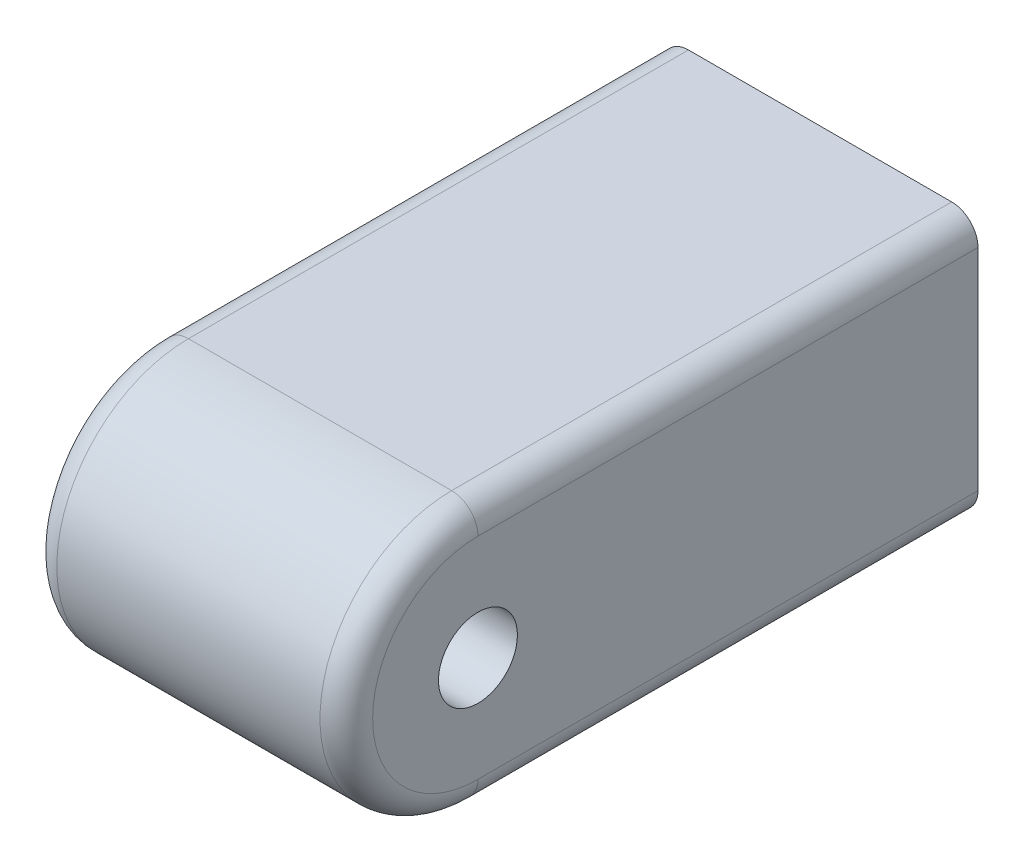
ISO-10303-21;
HEADER;
FILE_DESCRIPTION(('STEP AP214'),'2;1');
FILE_NAME('part.step','',(''),(''),'','','');
FILE_SCHEMA(('AUTOMOTIVE_DESIGN { 1 0 10303 214 1 1 1 1 }'));
ENDSEC;
DATA;
#1=APPLICATION_CONTEXT('core data for automotive mechanical design processes');
#2=APPLICATION_PROTOCOL_DEFINITION('international standard','automotive_design',2000,#1);
#3=PRODUCT_CONTEXT('',#1,'mechanical');
#4=PRODUCT('Part','Part','',(#3));
#5=PRODUCT_RELATED_PRODUCT_CATEGORY('part','',(#4));
#6=PRODUCT_DEFINITION_FORMATION('','',#4);
#7=PRODUCT_DEFINITION_CONTEXT('part definition',#1,'design');
#8=PRODUCT_DEFINITION('design','',#6,#7);
#9=PRODUCT_DEFINITION_SHAPE('','',#8);
#10=(LENGTH_UNIT() NAMED_UNIT(*) SI_UNIT(.MILLI.,.METRE.));
#11=(NAMED_UNIT(*) PLANE_ANGLE_UNIT() SI_UNIT($,.RADIAN.));
#12=(NAMED_UNIT(*) SI_UNIT($,.STERADIAN.) SOLID_ANGLE_UNIT());
#13=UNCERTAINTY_MEASURE_WITH_UNIT(LENGTH_MEASURE(1.E-05),#10,'distance_accuracy_value','');
#14=(GEOMETRIC_REPRESENTATION_CONTEXT(3) GLOBAL_UNCERTAINTY_ASSIGNED_CONTEXT((#13)) GLOBAL_UNIT_ASSIGNED_CONTEXT((#10,
#11,#12)) REPRESENTATION_CONTEXT('',''));
#15=CARTESIAN_POINT('',(0.,0.,0.));
#16=DIRECTION('',(0.,0.,1.));
#17=DIRECTION('',(1.,0.,0.));
#18=AXIS2_PLACEMENT_3D('',#15,#16,#17);
#19=CARTESIAN_POINT('',(60.,0.,35.));
#20=DIRECTION('',(-1.,0.,0.));
#21=DIRECTION('',(0.,0.,1.));
#22=AXIS2_PLACEMENT_3D('',#19,#20,#21);
#23=CYLINDRICAL_SURFACE('',#22,25.);
#24=DIRECTION('',(-1.,0.,0.));
#25=VECTOR('',#24,1.);
#26=CARTESIAN_POINT('',(60.,25.,35.));
#27=LINE('',#26,#25);
#28=CARTESIAN_POINT('',(55.,25.,35.));
#29=VERTEX_POINT('',#28);
#30=CARTESIAN_POINT('',(5.,25.,35.));
#31=VERTEX_POINT('',#30);
#32=EDGE_CURVE('E183',#29,#31,#27,.T.);
#33=ORIENTED_EDGE('',*,*,#32,.T.);
#34=CARTESIAN_POINT('',(5.,0.,35.));
#35=DIRECTION('',(1.,0.,0.));
#36=DIRECTION('',(0.,0.,-1.));
#37=AXIS2_PLACEMENT_3D('',#34,#35,#36);
#38=CIRCLE('',#37,25.);
#39=CARTESIAN_POINT('',(5.,-25.,35.));
#40=VERTEX_POINT('',#39);
#41=EDGE_CURVE('E218',#31,#40,#38,.T.);
#42=ORIENTED_EDGE('',*,*,#41,.T.);
#43=DIRECTION('',(-1.,0.,0.));
#44=VECTOR('',#43,1.);
#45=CARTESIAN_POINT('',(60.,-25.,35.));
#46=LINE('',#45,#44);
#47=CARTESIAN_POINT('',(55.,-25.,35.));
#48=VERTEX_POINT('',#47);
#49=EDGE_CURVE('E194',#48,#40,#46,.T.);
#50=ORIENTED_EDGE('',*,*,#49,.F.);
#51=CARTESIAN_POINT('',(55.,0.,35.));
#52=DIRECTION('',(1.,0.,0.));
#53=DIRECTION('',(0.,0.,-1.));
#54=AXIS2_PLACEMENT_3D('',#51,#52,#53);
#55=CIRCLE('',#54,25.);
#56=EDGE_CURVE('E216',#48,#29,#55,.F.);
#57=ORIENTED_EDGE('',*,*,#56,.T.);
#58=EDGE_LOOP('',(#33,#42,#50,#57));
#59=FACE_BOUND('',#58,.T.);
#60=ADVANCED_FACE('F37',(#59),#23,.T.);
#61=CARTESIAN_POINT('',(60.,-25.,-60.));
#62=DIRECTION('',(0.,1.,0.));
#63=DIRECTION('',(0.,0.,1.));
#64=AXIS2_PLACEMENT_3D('',#61,#62,#63);
#65=PLANE('',#64);
#66=ORIENTED_EDGE('',*,*,#49,.T.);
#67=DIRECTION('',(0.,0.,-1.));
#68=VECTOR('',#67,1.);
#69=CARTESIAN_POINT('',(5.,-25.,-60.));
#70=LINE('',#69,#68);
#71=CARTESIAN_POINT('',(5.,-25.,-60.));
#72=VERTEX_POINT('',#71);
#73=EDGE_CURVE('E199',#40,#72,#70,.T.);
#74=ORIENTED_EDGE('',*,*,#73,.T.);
#75=DIRECTION('',(-1.,0.,0.));
#76=VECTOR('',#75,1.);
#77=CARTESIAN_POINT('',(60.,-25.,-60.));
#78=LINE('',#77,#76);
#79=CARTESIAN_POINT('',(55.,-25.,-60.));
#80=VERTEX_POINT('',#79);
#81=EDGE_CURVE('E191',#80,#72,#78,.T.);
#82=ORIENTED_EDGE('',*,*,#81,.F.);
#83=DIRECTION('',(0.,0.,-1.));
#84=VECTOR('',#83,1.);
#85=CARTESIAN_POINT('',(55.,-25.,35.));
#86=LINE('',#85,#84);
#87=EDGE_CURVE('E197',#80,#48,#86,.F.);
#88=ORIENTED_EDGE('',*,*,#87,.T.);
#89=EDGE_LOOP('',(#66,#74,#82,#88));
#90=FACE_BOUND('',#89,.T.);
#91=ADVANCED_FACE('F262',(#90),#65,.F.);
#92=CARTESIAN_POINT('',(60.,25.,-60.));
#93=DIRECTION('',(0.,0.,1.));
#94=DIRECTION('',(1.,0.,0.));
#95=AXIS2_PLACEMENT_3D('',#92,#93,#94);
#96=PLANE('',#95);
#97=CARTESIAN_POINT('',(2.5,0.,-60.));
#98=DIRECTION('',(0.,0.,-1.));
#99=DIRECTION('',(-1.,0.,0.));
#100=AXIS2_PLACEMENT_3D('',#97,#98,#99);
#101=CIRCLE('',#100,1.5);
#102=CARTESIAN_POINT('',(1.,0.,-60.));
#103=VERTEX_POINT('',#102);
#104=EDGE_CURVE('E230',#103,#103,#101,.T.);
#105=ORIENTED_EDGE('',*,*,#104,.F.);
#106=EDGE_LOOP('',(#105));
#107=FACE_BOUND('',#106,.T.);
#108=CARTESIAN_POINT('',(57.5,0.,-60.));
#109=DIRECTION('',(0.,0.,-1.));
#110=DIRECTION('',(-1.,0.,0.));
#111=AXIS2_PLACEMENT_3D('',#108,#109,#110);
#112=CIRCLE('',#111,1.5);
#113=CARTESIAN_POINT('',(56.,0.,-60.));
#114=VERTEX_POINT('',#113);
#115=EDGE_CURVE('E553',#114,#114,#112,.T.);
#116=ORIENTED_EDGE('',*,*,#115,.F.);
#117=EDGE_LOOP('',(#116));
#118=FACE_BOUND('',#117,.T.);
#119=CARTESIAN_POINT('',(10.,22.5,-60.));
#120=DIRECTION('',(0.,0.,-1.));
#121=DIRECTION('',(-1.,0.,0.));
#122=AXIS2_PLACEMENT_3D('',#119,#120,#121);
#123=CIRCLE('',#122,1.5);
#124=CARTESIAN_POINT('',(8.5,22.5,-60.));
#125=VERTEX_POINT('',#124);
#126=EDGE_CURVE('E557',#125,#125,#123,.T.);
#127=ORIENTED_EDGE('',*,*,#126,.F.);
#128=EDGE_LOOP('',(#127));
#129=FACE_BOUND('',#128,.T.);
#130=CARTESIAN_POINT('',(10.,-22.5,-60.));
#131=DIRECTION('',(0.,0.,-1.));
#132=DIRECTION('',(-1.,0.,0.));
#133=AXIS2_PLACEMENT_3D('',#130,#131,#132);
#134=CIRCLE('',#133,1.5);
#135=CARTESIAN_POINT('',(8.5,-22.5,-60.));
#136=VERTEX_POINT('',#135);
#137=EDGE_CURVE('E561',#136,#136,#134,.T.);
#138=ORIENTED_EDGE('',*,*,#137,.F.);
#139=EDGE_LOOP('',(#138));
#140=FACE_BOUND('',#139,.T.);
#141=CARTESIAN_POINT('',(50.,-22.5,-60.));
#142=DIRECTION('',(0.,0.,-1.));
#143=DIRECTION('',(-1.,0.,0.));
#144=AXIS2_PLACEMENT_3D('',#141,#142,#143);
#145=CIRCLE('',#144,1.5);
#146=CARTESIAN_POINT('',(48.5,-22.5,-60.));
#147=VERTEX_POINT('',#146);
#148=EDGE_CURVE('E565',#147,#147,#145,.T.);
#149=ORIENTED_EDGE('',*,*,#148,.F.);
#150=EDGE_LOOP('',(#149));
#151=FACE_BOUND('',#150,.T.);
#152=CARTESIAN_POINT('',(50.,22.5,-60.));
#153=DIRECTION('',(0.,0.,-1.));
#154=DIRECTION('',(-1.,0.,0.));
#155=AXIS2_PLACEMENT_3D('',#152,#153,#154);
#156=CIRCLE('',#155,1.5);
#157=CARTESIAN_POINT('',(48.5,22.5,-60.));
#158=VERTEX_POINT('',#157);
#159=EDGE_CURVE('E158',#158,#158,#156,.T.);
#160=ORIENTED_EDGE('',*,*,#159,.F.);
#161=EDGE_LOOP('',(#160));
#162=FACE_BOUND('',#161,.T.);
#163=DIRECTION('',(1.,0.,0.));
#164=VECTOR('',#163,1.);
#165=CARTESIAN_POINT('',(55.,20.,-60.));
#166=LINE('',#165,#164);
#167=CARTESIAN_POINT('',(4.99999999999999,20.,-60.));
#168=VERTEX_POINT('',#167);
#169=CARTESIAN_POINT('',(55.,20.,-60.));
#170=VERTEX_POINT('',#169);
#171=EDGE_CURVE('E164',#168,#170,#166,.T.);
#172=ORIENTED_EDGE('',*,*,#171,.F.);
#173=DIRECTION('',(0.,1.,0.));
#174=VECTOR('',#173,1.);
#175=CARTESIAN_POINT('',(4.99999999999999,20.,-60.));
#176=LINE('',#175,#174);
#177=CARTESIAN_POINT('',(4.99999999999998,-20.,-60.));
#178=VERTEX_POINT('',#177);
#179=EDGE_CURVE('E135',#178,#168,#176,.T.);
#180=ORIENTED_EDGE('',*,*,#179,.F.);
#181=DIRECTION('',(-1.,0.,0.));
#182=VECTOR('',#181,1.);
#183=CARTESIAN_POINT('',(55.,-20.,-60.));
#184=LINE('',#183,#182);
#185=CARTESIAN_POINT('',(55.,-20.,-60.));
#186=VERTEX_POINT('',#185);
#187=EDGE_CURVE('E152',#186,#178,#184,.T.);
#188=ORIENTED_EDGE('',*,*,#187,.F.);
#189=DIRECTION('',(0.,-1.,0.));
#190=VECTOR('',#189,1.);
#191=CARTESIAN_POINT('',(55.,20.,-60.));
#192=LINE('',#191,#190);
#193=EDGE_CURVE('E155',#170,#186,#192,.T.);
#194=ORIENTED_EDGE('',*,*,#193,.F.);
#195=EDGE_LOOP('',(#172,#180,#188,#194));
#196=FACE_BOUND('',#195,.T.);
#197=ORIENTED_EDGE('',*,*,#81,.T.);
#198=CARTESIAN_POINT('',(5.,-20.,-60.));
#199=DIRECTION('',(0.,0.,1.));
#200=DIRECTION('',(1.,0.,0.));
#201=AXIS2_PLACEMENT_3D('',#198,#199,#200);
#202=CIRCLE('',#201,5.);
#203=CARTESIAN_POINT('',(0.,-20.,-60.));
#204=VERTEX_POINT('',#203);
#205=EDGE_CURVE('E208',#72,#204,#202,.F.);
#206=ORIENTED_EDGE('',*,*,#205,.T.);
#207=DIRECTION('',(0.,1.,0.));
#208=VECTOR('',#207,1.);
#209=CARTESIAN_POINT('',(0.,25.,-60.));
#210=LINE('',#209,#208);
#211=CARTESIAN_POINT('',(0.,20.,-60.));
#212=VERTEX_POINT('',#211);
#213=EDGE_CURVE('E180',#204,#212,#210,.T.);
#214=ORIENTED_EDGE('',*,*,#213,.T.);
#215=CARTESIAN_POINT('',(5.,20.,-60.));
#216=DIRECTION('',(0.,0.,1.));
#217=DIRECTION('',(1.,0.,0.));
#218=AXIS2_PLACEMENT_3D('',#215,#216,#217);
#219=CIRCLE('',#218,5.);
#220=CARTESIAN_POINT('',(5.,25.,-60.));
#221=VERTEX_POINT('',#220);
#222=EDGE_CURVE('E204',#212,#221,#219,.F.);
#223=ORIENTED_EDGE('',*,*,#222,.T.);
#224=DIRECTION('',(-1.,0.,0.));
#225=VECTOR('',#224,1.);
#226=CARTESIAN_POINT('',(60.,25.,-60.));
#227=LINE('',#226,#225);
#228=CARTESIAN_POINT('',(55.,25.,-60.));
#229=VERTEX_POINT('',#228);
#230=EDGE_CURVE('E188',#229,#221,#227,.T.);
#231=ORIENTED_EDGE('',*,*,#230,.F.);
#232=CARTESIAN_POINT('',(55.,20.,-60.));
#233=DIRECTION('',(0.,0.,1.));
#234=DIRECTION('',(1.,0.,0.));
#235=AXIS2_PLACEMENT_3D('',#232,#233,#234);
#236=CIRCLE('',#235,5.);
#237=CARTESIAN_POINT('',(60.,20.,-60.));
#238=VERTEX_POINT('',#237);
#239=EDGE_CURVE('E202',#229,#238,#236,.F.);
#240=ORIENTED_EDGE('',*,*,#239,.T.);
#241=DIRECTION('',(0.,1.,0.));
#242=VECTOR('',#241,1.);
#243=CARTESIAN_POINT('',(60.,25.,-60.));
#244=LINE('',#243,#242);
#245=CARTESIAN_POINT('',(60.,-20.,-60.));
#246=VERTEX_POINT('',#245);
#247=EDGE_CURVE('E181',#246,#238,#244,.T.);
#248=ORIENTED_EDGE('',*,*,#247,.F.);
#249=CARTESIAN_POINT('',(55.,-20.,-60.));
#250=DIRECTION('',(0.,0.,1.));
#251=DIRECTION('',(1.,0.,0.));
#252=AXIS2_PLACEMENT_3D('',#249,#250,#251);
#253=CIRCLE('',#252,5.);
#254=EDGE_CURVE('E206',#246,#80,#253,.F.);
#255=ORIENTED_EDGE('',*,*,#254,.T.);
#256=EDGE_LOOP('',(#197,#206,#214,#223,#231,#240,#248,#255));
#257=FACE_BOUND('',#256,.T.);
#258=ADVANCED_FACE('F249',(#107,#118,#129,#140,#151,#162,#196,#257),#96,.F.);
#259=CARTESIAN_POINT('',(60.,25.,35.));
#260=DIRECTION('',(0.,-1.,0.));
#261=DIRECTION('',(0.,0.,-1.));
#262=AXIS2_PLACEMENT_3D('',#259,#260,#261);
#263=PLANE('',#262);
#264=ORIENTED_EDGE('',*,*,#230,.T.);
#265=DIRECTION('',(0.,0.,1.));
#266=VECTOR('',#265,1.);
#267=CARTESIAN_POINT('',(5.,25.,35.));
#268=LINE('',#267,#266);
#269=EDGE_CURVE('E11',#221,#31,#268,.T.);
#270=ORIENTED_EDGE('',*,*,#269,.T.);
#271=ORIENTED_EDGE('',*,*,#32,.F.);
#272=DIRECTION('',(0.,0.,1.));
#273=VECTOR('',#272,1.);
#274=CARTESIAN_POINT('',(55.,25.,-60.));
#275=LINE('',#274,#273);
#276=EDGE_CURVE('E46',#29,#229,#275,.F.);
#277=ORIENTED_EDGE('',*,*,#276,.T.);
#278=EDGE_LOOP('',(#264,#270,#271,#277));
#279=FACE_BOUND('',#278,.T.);
#280=ADVANCED_FACE('F246',(#279),#263,.F.);
#281=CARTESIAN_POINT('',(60.,0.,35.));
#282=DIRECTION('',(1.,0.,0.));
#283=DIRECTION('',(0.,0.,-1.));
#284=AXIS2_PLACEMENT_3D('',#281,#282,#283);
#285=PLANE('',#284);
#286=CARTESIAN_POINT('',(60.,0.,35.));
#287=DIRECTION('',(1.,0.,0.));
#288=DIRECTION('',(0.,0.,-1.));
#289=AXIS2_PLACEMENT_3D('',#286,#287,#288);
#290=CIRCLE('',#289,7.5);
#291=CARTESIAN_POINT('',(60.,0.,27.5));
#292=VERTEX_POINT('',#291);
#293=EDGE_CURVE('E171',#292,#292,#290,.T.);
#294=ORIENTED_EDGE('',*,*,#293,.F.);
#295=EDGE_LOOP('',(#294));
#296=FACE_BOUND('',#295,.T.);
#297=CARTESIAN_POINT('',(60.,0.,35.));
#298=DIRECTION('',(1.,0.,0.));
#299=DIRECTION('',(0.,0.,-1.));
#300=AXIS2_PLACEMENT_3D('',#297,#298,#299);
#301=CIRCLE('',#300,20.);
#302=CARTESIAN_POINT('',(60.,20.,35.));
#303=VERTEX_POINT('',#302);
#304=CARTESIAN_POINT('',(60.,-20.,35.));
#305=VERTEX_POINT('',#304);
#306=EDGE_CURVE('E54',#303,#305,#301,.T.);
#307=ORIENTED_EDGE('',*,*,#306,.T.);
#308=DIRECTION('',(0.,0.,-1.));
#309=VECTOR('',#308,1.);
#310=CARTESIAN_POINT('',(60.,-20.,-60.));
#311=LINE('',#310,#309);
#312=EDGE_CURVE('E222',#305,#246,#311,.T.);
#313=ORIENTED_EDGE('',*,*,#312,.T.);
#314=ORIENTED_EDGE('',*,*,#247,.T.);
#315=DIRECTION('',(0.,0.,1.));
#316=VECTOR('',#315,1.);
#317=CARTESIAN_POINT('',(60.,20.,35.));
#318=LINE('',#317,#316);
#319=EDGE_CURVE('E59',#238,#303,#318,.T.);
#320=ORIENTED_EDGE('',*,*,#319,.T.);
#321=EDGE_LOOP('',(#307,#313,#314,#320));
#322=FACE_BOUND('',#321,.T.);
#323=ADVANCED_FACE('F275',(#296,#322),#285,.T.);
#324=CARTESIAN_POINT('',(0.,0.,35.));
#325=DIRECTION('',(1.,0.,0.));
#326=DIRECTION('',(0.,0.,-1.));
#327=AXIS2_PLACEMENT_3D('',#324,#325,#326);
#328=PLANE('',#327);
#329=CARTESIAN_POINT('',(0.,0.,35.));
#330=DIRECTION('',(1.,0.,0.));
#331=DIRECTION('',(0.,0.,-1.));
#332=AXIS2_PLACEMENT_3D('',#329,#330,#331);
#333=CIRCLE('',#332,7.5);
#334=CARTESIAN_POINT('',(0.,0.,27.5));
#335=VERTEX_POINT('',#334);
#336=EDGE_CURVE('E177',#335,#335,#333,.F.);
#337=ORIENTED_EDGE('',*,*,#336,.F.);
#338=EDGE_LOOP('',(#337));
#339=FACE_BOUND('',#338,.T.);
#340=ORIENTED_EDGE('',*,*,#213,.F.);
#341=DIRECTION('',(0.,0.,-1.));
#342=VECTOR('',#341,1.);
#343=CARTESIAN_POINT('',(0.,-20.,35.));
#344=LINE('',#343,#342);
#345=CARTESIAN_POINT('',(0.,-20.,35.));
#346=VERTEX_POINT('',#345);
#347=EDGE_CURVE('E214',#204,#346,#344,.F.);
#348=ORIENTED_EDGE('',*,*,#347,.T.);
#349=CARTESIAN_POINT('',(0.,0.,35.));
#350=DIRECTION('',(1.,0.,0.));
#351=DIRECTION('',(0.,0.,-1.));
#352=AXIS2_PLACEMENT_3D('',#349,#350,#351);
#353=CIRCLE('',#352,20.);
#354=CARTESIAN_POINT('',(0.,20.,35.));
#355=VERTEX_POINT('',#354);
#356=EDGE_CURVE('E212',#346,#355,#353,.F.);
#357=ORIENTED_EDGE('',*,*,#356,.T.);
#358=DIRECTION('',(0.,0.,1.));
#359=VECTOR('',#358,1.);
#360=CARTESIAN_POINT('',(0.,20.,35.));
#361=LINE('',#360,#359);
#362=EDGE_CURVE('E210',#355,#212,#361,.F.);
#363=ORIENTED_EDGE('',*,*,#362,.T.);
#364=EDGE_LOOP('',(#340,#348,#357,#363));
#365=FACE_BOUND('',#364,.T.);
#366=ADVANCED_FACE('F272',(#339,#365),#328,.F.);
#367=CARTESIAN_POINT('',(-0.001000000000001,0.,35.));
#368=DIRECTION('',(1.,0.,0.));
#369=DIRECTION('',(0.,0.,-1.));
#370=AXIS2_PLACEMENT_3D('',#367,#368,#369);
#371=CYLINDRICAL_SURFACE('',#370,7.5);
#372=ORIENTED_EDGE('',*,*,#293,.T.);
#373=EDGE_LOOP('',(#372));
#374=FACE_BOUND('',#373,.T.);
#375=ORIENTED_EDGE('',*,*,#336,.T.);
#376=EDGE_LOOP('',(#375));
#377=FACE_BOUND('',#376,.T.);
#378=ADVANCED_FACE('F274',(#374,#377),#371,.F.);
#379=CARTESIAN_POINT('',(4.99999999999999,20.,10.));
#380=DIRECTION('',(-1.,0.,0.));
#381=DIRECTION('',(0.,-1.,0.));
#382=AXIS2_PLACEMENT_3D('',#379,#380,#381);
#383=PLANE('',#382);
#384=ORIENTED_EDGE('',*,*,#179,.T.);
#385=DIRECTION('',(0.,0.,-1.));
#386=VECTOR('',#385,1.);
#387=CARTESIAN_POINT('',(4.99999999999999,20.,10.));
#388=LINE('',#387,#386);
#389=CARTESIAN_POINT('',(4.99999999999999,20.,10.));
#390=VERTEX_POINT('',#389);
#391=EDGE_CURVE('E128',#390,#168,#388,.T.);
#392=ORIENTED_EDGE('',*,*,#391,.F.);
#393=DIRECTION('',(0.,1.,0.));
#394=VECTOR('',#393,1.);
#395=CARTESIAN_POINT('',(4.99999999999999,20.,10.));
#396=LINE('',#395,#394);
#397=CARTESIAN_POINT('',(4.99999999999998,-20.,10.));
#398=VERTEX_POINT('',#397);
#399=EDGE_CURVE('E132',#398,#390,#396,.T.);
#400=ORIENTED_EDGE('',*,*,#399,.F.);
#401=DIRECTION('',(0.,0.,-1.));
#402=VECTOR('',#401,1.);
#403=CARTESIAN_POINT('',(4.99999999999998,-20.,10.));
#404=LINE('',#403,#402);
#405=EDGE_CURVE('E169',#398,#178,#404,.T.);
#406=ORIENTED_EDGE('',*,*,#405,.T.);
#407=EDGE_LOOP('',(#384,#392,#400,#406));
#408=FACE_BOUND('',#407,.T.);
#409=ADVANCED_FACE('F130',(#408),#383,.F.);
#410=CARTESIAN_POINT('',(55.,-20.,10.));
#411=DIRECTION('',(0.,-1.,0.));
#412=DIRECTION('',(0.,0.,-1.));
#413=AXIS2_PLACEMENT_3D('',#410,#411,#412);
#414=PLANE('',#413);
#415=ORIENTED_EDGE('',*,*,#187,.T.);
#416=ORIENTED_EDGE('',*,*,#405,.F.);
#417=DIRECTION('',(-1.,0.,0.));
#418=VECTOR('',#417,1.);
#419=CARTESIAN_POINT('',(55.,-20.,10.));
#420=LINE('',#419,#418);
#421=CARTESIAN_POINT('',(55.,-20.,10.));
#422=VERTEX_POINT('',#421);
#423=EDGE_CURVE('E140',#422,#398,#420,.T.);
#424=ORIENTED_EDGE('',*,*,#423,.F.);
#425=DIRECTION('',(0.,0.,-1.));
#426=VECTOR('',#425,1.);
#427=CARTESIAN_POINT('',(55.,-20.,10.));
#428=LINE('',#427,#426);
#429=EDGE_CURVE('E172',#422,#186,#428,.T.);
#430=ORIENTED_EDGE('',*,*,#429,.T.);
#431=EDGE_LOOP('',(#415,#416,#424,#430));
#432=FACE_BOUND('',#431,.T.);
#433=ADVANCED_FACE('F437',(#432),#414,.F.);
#434=CARTESIAN_POINT('',(55.,20.,10.));
#435=DIRECTION('',(1.,0.,0.));
#436=DIRECTION('',(0.,0.,-1.));
#437=AXIS2_PLACEMENT_3D('',#434,#435,#436);
#438=PLANE('',#437);
#439=ORIENTED_EDGE('',*,*,#193,.T.);
#440=ORIENTED_EDGE('',*,*,#429,.F.);
#441=DIRECTION('',(0.,-1.,0.));
#442=VECTOR('',#441,1.);
#443=CARTESIAN_POINT('',(55.,20.,10.));
#444=LINE('',#443,#442);
#445=CARTESIAN_POINT('',(55.,20.,10.));
#446=VERTEX_POINT('',#445);
#447=EDGE_CURVE('E148',#446,#422,#444,.T.);
#448=ORIENTED_EDGE('',*,*,#447,.F.);
#449=DIRECTION('',(0.,0.,-1.));
#450=VECTOR('',#449,1.);
#451=CARTESIAN_POINT('',(55.,20.,10.));
#452=LINE('',#451,#450);
#453=EDGE_CURVE('E139',#446,#170,#452,.T.);
#454=ORIENTED_EDGE('',*,*,#453,.T.);
#455=EDGE_LOOP('',(#439,#440,#448,#454));
#456=FACE_BOUND('',#455,.T.);
#457=ADVANCED_FACE('F430',(#456),#438,.F.);
#458=CARTESIAN_POINT('',(55.,20.,10.));
#459=DIRECTION('',(0.,1.,0.));
#460=DIRECTION('',(0.,0.,1.));
#461=AXIS2_PLACEMENT_3D('',#458,#459,#460);
#462=PLANE('',#461);
#463=ORIENTED_EDGE('',*,*,#171,.T.);
#464=ORIENTED_EDGE('',*,*,#453,.F.);
#465=DIRECTION('',(1.,0.,0.));
#466=VECTOR('',#465,1.);
#467=CARTESIAN_POINT('',(55.,20.,10.));
#468=LINE('',#467,#466);
#469=EDGE_CURVE('E143',#390,#446,#468,.T.);
#470=ORIENTED_EDGE('',*,*,#469,.F.);
#471=ORIENTED_EDGE('',*,*,#391,.T.);
#472=EDGE_LOOP('',(#463,#464,#470,#471));
#473=FACE_BOUND('',#472,.T.);
#474=ADVANCED_FACE('F144',(#473),#462,.F.);
#475=CARTESIAN_POINT('',(0.,0.,10.));
#476=DIRECTION('',(0.,0.,-1.));
#477=DIRECTION('',(-1.,0.,0.));
#478=AXIS2_PLACEMENT_3D('',#475,#476,#477);
#479=PLANE('',#478);
#480=ORIENTED_EDGE('',*,*,#399,.T.);
#481=ORIENTED_EDGE('',*,*,#469,.T.);
#482=ORIENTED_EDGE('',*,*,#447,.T.);
#483=ORIENTED_EDGE('',*,*,#423,.T.);
#484=EDGE_LOOP('',(#480,#481,#482,#483));
#485=FACE_BOUND('',#484,.T.);
#486=ADVANCED_FACE('F150',(#485),#479,.T.);
#487=CARTESIAN_POINT('',(50.,22.5,-50.));
#488=DIRECTION('',(0.,0.,-1.));
#489=DIRECTION('',(-1.,0.,0.));
#490=AXIS2_PLACEMENT_3D('',#487,#488,#489);
#491=CYLINDRICAL_SURFACE('',#490,1.5);
#492=CARTESIAN_POINT('',(50.,22.5,-50.));
#493=DIRECTION('',(0.,0.,-1.));
#494=DIRECTION('',(-1.,0.,0.));
#495=AXIS2_PLACEMENT_3D('',#492,#493,#494);
#496=CIRCLE('',#495,1.5);
#497=CARTESIAN_POINT('',(48.5,22.5,-50.));
#498=VERTEX_POINT('',#497);
#499=EDGE_CURVE('E165',#498,#498,#496,.T.);
#500=ORIENTED_EDGE('',*,*,#499,.F.);
#501=EDGE_LOOP('',(#500));
#502=FACE_BOUND('',#501,.T.);
#503=ORIENTED_EDGE('',*,*,#159,.T.);
#504=EDGE_LOOP('',(#503));
#505=FACE_BOUND('',#504,.T.);
#506=ADVANCED_FACE('F409',(#502,#505),#491,.F.);
#507=CARTESIAN_POINT('',(50.,22.5,-50.));
#508=DIRECTION('',(0.,0.,-1.));
#509=DIRECTION('',(-1.,0.,0.));
#510=AXIS2_PLACEMENT_3D('',#507,#508,#509);
#511=PLANE('',#510);
#512=ORIENTED_EDGE('',*,*,#499,.T.);
#513=EDGE_LOOP('',(#512));
#514=FACE_BOUND('',#513,.T.);
#515=ADVANCED_FACE('F401',(#514),#511,.T.);
#516=CARTESIAN_POINT('',(50.,-22.5,-50.));
#517=DIRECTION('',(0.,0.,-1.));
#518=DIRECTION('',(-1.,0.,0.));
#519=AXIS2_PLACEMENT_3D('',#516,#517,#518);
#520=CYLINDRICAL_SURFACE('',#519,1.5);
#521=CARTESIAN_POINT('',(50.,-22.5,-50.));
#522=DIRECTION('',(0.,0.,-1.));
#523=DIRECTION('',(-1.,0.,0.));
#524=AXIS2_PLACEMENT_3D('',#521,#522,#523);
#525=CIRCLE('',#524,1.5);
#526=CARTESIAN_POINT('',(48.5,-22.5,-50.));
#527=VERTEX_POINT('',#526);
#528=EDGE_CURVE('E572',#527,#527,#525,.T.);
#529=ORIENTED_EDGE('',*,*,#528,.F.);
#530=EDGE_LOOP('',(#529));
#531=FACE_BOUND('',#530,.T.);
#532=ORIENTED_EDGE('',*,*,#148,.T.);
#533=EDGE_LOOP('',(#532));
#534=FACE_BOUND('',#533,.T.);
#535=ADVANCED_FACE('F393',(#531,#534),#520,.F.);
#536=CARTESIAN_POINT('',(50.,-22.5,-50.));
#537=DIRECTION('',(0.,0.,-1.));
#538=DIRECTION('',(-1.,0.,0.));
#539=AXIS2_PLACEMENT_3D('',#536,#537,#538);
#540=PLANE('',#539);
#541=ORIENTED_EDGE('',*,*,#528,.T.);
#542=EDGE_LOOP('',(#541));
#543=FACE_BOUND('',#542,.T.);
#544=ADVANCED_FACE('F385',(#543),#540,.T.);
#545=CARTESIAN_POINT('',(10.,-22.5,-50.));
#546=DIRECTION('',(0.,0.,-1.));
#547=DIRECTION('',(-1.,0.,0.));
#548=AXIS2_PLACEMENT_3D('',#545,#546,#547);
#549=CYLINDRICAL_SURFACE('',#548,1.5);
#550=CARTESIAN_POINT('',(10.,-22.5,-50.));
#551=DIRECTION('',(0.,0.,-1.));
#552=DIRECTION('',(-1.,0.,0.));
#553=AXIS2_PLACEMENT_3D('',#550,#551,#552);
#554=CIRCLE('',#553,1.5);
#555=CARTESIAN_POINT('',(8.5,-22.5,-50.));
#556=VERTEX_POINT('',#555);
#557=EDGE_CURVE('E577',#556,#556,#554,.T.);
#558=ORIENTED_EDGE('',*,*,#557,.F.);
#559=EDGE_LOOP('',(#558));
#560=FACE_BOUND('',#559,.T.);
#561=ORIENTED_EDGE('',*,*,#137,.T.);
#562=EDGE_LOOP('',(#561));
#563=FACE_BOUND('',#562,.T.);
#564=ADVANCED_FACE('F377',(#560,#563),#549,.F.);
#565=CARTESIAN_POINT('',(10.,-22.5,-50.));
#566=DIRECTION('',(0.,0.,-1.));
#567=DIRECTION('',(-1.,0.,0.));
#568=AXIS2_PLACEMENT_3D('',#565,#566,#567);
#569=PLANE('',#568);
#570=ORIENTED_EDGE('',*,*,#557,.T.);
#571=EDGE_LOOP('',(#570));
#572=FACE_BOUND('',#571,.T.);
#573=ADVANCED_FACE('F369',(#572),#569,.T.);
#574=CARTESIAN_POINT('',(10.,22.5,-50.));
#575=DIRECTION('',(0.,0.,-1.));
#576=DIRECTION('',(-1.,0.,0.));
#577=AXIS2_PLACEMENT_3D('',#574,#575,#576);
#578=CYLINDRICAL_SURFACE('',#577,1.5);
#579=CARTESIAN_POINT('',(10.,22.5,-50.));
#580=DIRECTION('',(0.,0.,-1.));
#581=DIRECTION('',(-1.,0.,0.));
#582=AXIS2_PLACEMENT_3D('',#579,#580,#581);
#583=CIRCLE('',#582,1.5);
#584=CARTESIAN_POINT('',(8.5,22.5,-50.));
#585=VERTEX_POINT('',#584);
#586=EDGE_CURVE('E583',#585,#585,#583,.T.);
#587=ORIENTED_EDGE('',*,*,#586,.F.);
#588=EDGE_LOOP('',(#587));
#589=FACE_BOUND('',#588,.T.);
#590=ORIENTED_EDGE('',*,*,#126,.T.);
#591=EDGE_LOOP('',(#590));
#592=FACE_BOUND('',#591,.T.);
#593=ADVANCED_FACE('F361',(#589,#592),#578,.F.);
#594=CARTESIAN_POINT('',(10.,22.5,-50.));
#595=DIRECTION('',(0.,0.,-1.));
#596=DIRECTION('',(-1.,0.,0.));
#597=AXIS2_PLACEMENT_3D('',#594,#595,#596);
#598=PLANE('',#597);
#599=ORIENTED_EDGE('',*,*,#586,.T.);
#600=EDGE_LOOP('',(#599));
#601=FACE_BOUND('',#600,.T.);
#602=ADVANCED_FACE('F353',(#601),#598,.T.);
#603=CARTESIAN_POINT('',(57.5,0.,-50.));
#604=DIRECTION('',(0.,0.,-1.));
#605=DIRECTION('',(-1.,0.,0.));
#606=AXIS2_PLACEMENT_3D('',#603,#604,#605);
#607=CYLINDRICAL_SURFACE('',#606,1.5);
#608=CARTESIAN_POINT('',(57.5,0.,-50.));
#609=DIRECTION('',(0.,0.,-1.));
#610=DIRECTION('',(-1.,0.,0.));
#611=AXIS2_PLACEMENT_3D('',#608,#609,#610);
#612=CIRCLE('',#611,1.5);
#613=CARTESIAN_POINT('',(56.,0.,-50.));
#614=VERTEX_POINT('',#613);
#615=EDGE_CURVE('E587',#614,#614,#612,.T.);
#616=ORIENTED_EDGE('',*,*,#615,.F.);
#617=EDGE_LOOP('',(#616));
#618=FACE_BOUND('',#617,.T.);
#619=ORIENTED_EDGE('',*,*,#115,.T.);
#620=EDGE_LOOP('',(#619));
#621=FACE_BOUND('',#620,.T.);
#622=ADVANCED_FACE('F345',(#618,#621),#607,.F.);
#623=CARTESIAN_POINT('',(57.5,0.,-50.));
#624=DIRECTION('',(0.,0.,-1.));
#625=DIRECTION('',(-1.,0.,0.));
#626=AXIS2_PLACEMENT_3D('',#623,#624,#625);
#627=PLANE('',#626);
#628=ORIENTED_EDGE('',*,*,#615,.T.);
#629=EDGE_LOOP('',(#628));
#630=FACE_BOUND('',#629,.T.);
#631=ADVANCED_FACE('F337',(#630),#627,.T.);
#632=CARTESIAN_POINT('',(2.5,0.,-50.));
#633=DIRECTION('',(0.,0.,-1.));
#634=DIRECTION('',(-1.,0.,0.));
#635=AXIS2_PLACEMENT_3D('',#632,#633,#634);
#636=CYLINDRICAL_SURFACE('',#635,1.5);
#637=CARTESIAN_POINT('',(2.5,0.,-50.));
#638=DIRECTION('',(0.,0.,-1.));
#639=DIRECTION('',(-1.,0.,0.));
#640=AXIS2_PLACEMENT_3D('',#637,#638,#639);
#641=CIRCLE('',#640,1.5);
#642=CARTESIAN_POINT('',(1.,0.,-50.));
#643=VERTEX_POINT('',#642);
#644=EDGE_CURVE('E591',#643,#643,#641,.T.);
#645=ORIENTED_EDGE('',*,*,#644,.F.);
#646=EDGE_LOOP('',(#645));
#647=FACE_BOUND('',#646,.T.);
#648=ORIENTED_EDGE('',*,*,#104,.T.);
#649=EDGE_LOOP('',(#648));
#650=FACE_BOUND('',#649,.T.);
#651=ADVANCED_FACE('F329',(#647,#650),#636,.F.);
#652=CARTESIAN_POINT('',(2.5,0.,-50.));
#653=DIRECTION('',(0.,0.,-1.));
#654=DIRECTION('',(-1.,0.,0.));
#655=AXIS2_PLACEMENT_3D('',#652,#653,#654);
#656=PLANE('',#655);
#657=ORIENTED_EDGE('',*,*,#644,.T.);
#658=EDGE_LOOP('',(#657));
#659=FACE_BOUND('',#658,.T.);
#660=ADVANCED_FACE('F302',(#659),#656,.T.);
#661=CARTESIAN_POINT('',(5.,20.,35.));
#662=DIRECTION('',(0.,0.,1.));
#663=DIRECTION('',(0.,-1.,0.));
#664=AXIS2_PLACEMENT_3D('',#661,#662,#663);
#665=CYLINDRICAL_SURFACE('',#664,5.);
#666=ORIENTED_EDGE('',*,*,#222,.F.);
#667=ORIENTED_EDGE('',*,*,#362,.F.);
#668=CARTESIAN_POINT('',(5.,20.,35.));
#669=DIRECTION('',(0.,0.,1.));
#670=DIRECTION('',(1.,0.,0.));
#671=AXIS2_PLACEMENT_3D('',#668,#669,#670);
#672=CIRCLE('',#671,5.);
#673=EDGE_CURVE('E228',#31,#355,#672,.T.);
#674=ORIENTED_EDGE('',*,*,#673,.F.);
#675=ORIENTED_EDGE('',*,*,#269,.F.);
#676=EDGE_LOOP('',(#666,#667,#674,#675));
#677=FACE_BOUND('',#676,.T.);
#678=ADVANCED_FACE('F255',(#677),#665,.T.);
#679=CARTESIAN_POINT('',(5.,0.,35.));
#680=DIRECTION('',(1.,0.,0.));
#681=DIRECTION('',(0.,0.,-1.));
#682=AXIS2_PLACEMENT_3D('',#679,#680,#681);
#683=TOROIDAL_SURFACE('',#682,20.,5.);
#684=ORIENTED_EDGE('',*,*,#673,.T.);
#685=ORIENTED_EDGE('',*,*,#356,.F.);
#686=CARTESIAN_POINT('',(5.,-20.,35.));
#687=DIRECTION('',(0.,0.,-1.));
#688=DIRECTION('',(-1.,0.,0.));
#689=AXIS2_PLACEMENT_3D('',#686,#687,#688);
#690=CIRCLE('',#689,5.);
#691=EDGE_CURVE('E225',#40,#346,#690,.T.);
#692=ORIENTED_EDGE('',*,*,#691,.F.);
#693=ORIENTED_EDGE('',*,*,#41,.F.);
#694=EDGE_LOOP('',(#684,#685,#692,#693));
#695=FACE_BOUND('',#694,.T.);
#696=ADVANCED_FACE('F267',(#695),#683,.T.);
#697=CARTESIAN_POINT('',(5.,-20.,-60.));
#698=DIRECTION('',(0.,0.,-1.));
#699=DIRECTION('',(0.,1.,0.));
#700=AXIS2_PLACEMENT_3D('',#697,#698,#699);
#701=CYLINDRICAL_SURFACE('',#700,5.);
#702=ORIENTED_EDGE('',*,*,#691,.T.);
#703=ORIENTED_EDGE('',*,*,#347,.F.);
#704=ORIENTED_EDGE('',*,*,#205,.F.);
#705=ORIENTED_EDGE('',*,*,#73,.F.);
#706=EDGE_LOOP('',(#702,#703,#704,#705));
#707=FACE_BOUND('',#706,.T.);
#708=ADVANCED_FACE('F270',(#707),#701,.T.);
#709=CARTESIAN_POINT('',(55.,20.,35.));
#710=DIRECTION('',(0.,0.,-1.));
#711=DIRECTION('',(0.,1.,0.));
#712=AXIS2_PLACEMENT_3D('',#709,#710,#711);
#713=CYLINDRICAL_SURFACE('',#712,5.);
#714=ORIENTED_EDGE('',*,*,#239,.F.);
#715=ORIENTED_EDGE('',*,*,#276,.F.);
#716=CARTESIAN_POINT('',(55.,20.,35.));
#717=DIRECTION('',(0.,0.,1.));
#718=DIRECTION('',(1.,0.,0.));
#719=AXIS2_PLACEMENT_3D('',#716,#717,#718);
#720=CIRCLE('',#719,5.);
#721=EDGE_CURVE('E41',#303,#29,#720,.T.);
#722=ORIENTED_EDGE('',*,*,#721,.F.);
#723=ORIENTED_EDGE('',*,*,#319,.F.);
#724=EDGE_LOOP('',(#714,#715,#722,#723));
#725=FACE_BOUND('',#724,.T.);
#726=ADVANCED_FACE('F39',(#725),#713,.T.);
#727=CARTESIAN_POINT('',(55.,0.,35.));
#728=DIRECTION('',(1.,0.,0.));
#729=DIRECTION('',(0.,0.,-1.));
#730=AXIS2_PLACEMENT_3D('',#727,#728,#729);
#731=TOROIDAL_SURFACE('',#730,20.,5.);
#732=ORIENTED_EDGE('',*,*,#721,.T.);
#733=ORIENTED_EDGE('',*,*,#56,.F.);
#734=CARTESIAN_POINT('',(55.,-20.,35.));
#735=DIRECTION('',(0.,0.,-1.));
#736=DIRECTION('',(-1.,0.,0.));
#737=AXIS2_PLACEMENT_3D('',#734,#735,#736);
#738=CIRCLE('',#737,5.);
#739=EDGE_CURVE('E231',#305,#48,#738,.T.);
#740=ORIENTED_EDGE('',*,*,#739,.F.);
#741=ORIENTED_EDGE('',*,*,#306,.F.);
#742=EDGE_LOOP('',(#732,#733,#740,#741));
#743=FACE_BOUND('',#742,.T.);
#744=ADVANCED_FACE('F239',(#743),#731,.T.);
#745=CARTESIAN_POINT('',(55.,-20.,35.));
#746=DIRECTION('',(0.,0.,1.));
#747=DIRECTION('',(0.,-1.,0.));
#748=AXIS2_PLACEMENT_3D('',#745,#746,#747);
#749=CYLINDRICAL_SURFACE('',#748,5.);
#750=ORIENTED_EDGE('',*,*,#739,.T.);
#751=ORIENTED_EDGE('',*,*,#87,.F.);
#752=ORIENTED_EDGE('',*,*,#254,.F.);
#753=ORIENTED_EDGE('',*,*,#312,.F.);
#754=EDGE_LOOP('',(#750,#751,#752,#753));
#755=FACE_BOUND('',#754,.T.);
#756=ADVANCED_FACE('F303',(#755),#749,.T.);
#757=CLOSED_SHELL('',(#60,#91,#258,#280,#323,#366,#378,#409,#433,#457,#474,#486,#506,#515,#535,
#544,#564,#573,#593,#602,#622,#631,#651,#660,#678,#696,#708,#726,#744,#756));
#758=MANIFOLD_SOLID_BREP('B2',#757);
#759=ADVANCED_BREP_SHAPE_REPRESENTATION('',(#18,#758),#14);
#760=SHAPE_DEFINITION_REPRESENTATION(#9,#759);
ENDSEC;
END-ISO-10303-21;
